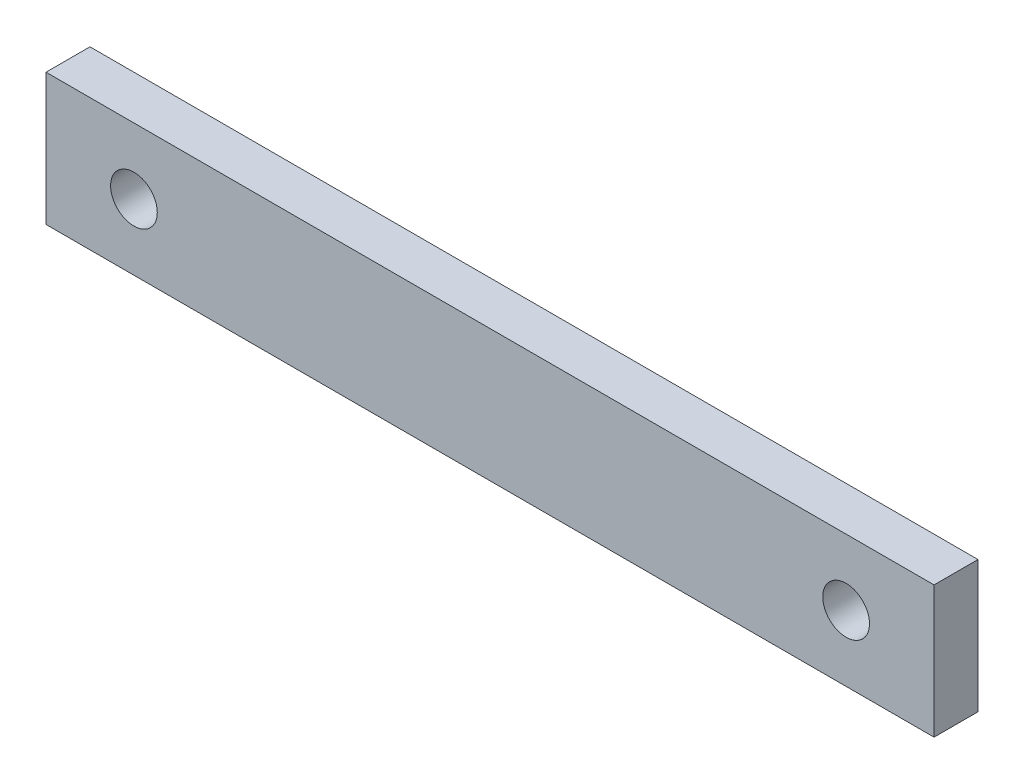
ISO-10303-21;
HEADER;
FILE_DESCRIPTION(('STEP AP214'),'2;1');
FILE_NAME('part.step','',(''),(''),'','','');
FILE_SCHEMA(('AUTOMOTIVE_DESIGN { 1 0 10303 214 1 1 1 1 }'));
ENDSEC;
DATA;
#1=APPLICATION_CONTEXT('core data for automotive mechanical design processes');
#2=APPLICATION_PROTOCOL_DEFINITION('international standard','automotive_design',2000,#1);
#3=PRODUCT_CONTEXT('',#1,'mechanical');
#4=PRODUCT('Part','Part','',(#3));
#5=PRODUCT_RELATED_PRODUCT_CATEGORY('part','',(#4));
#6=PRODUCT_DEFINITION_FORMATION('','',#4);
#7=PRODUCT_DEFINITION_CONTEXT('part definition',#1,'design');
#8=PRODUCT_DEFINITION('design','',#6,#7);
#9=PRODUCT_DEFINITION_SHAPE('','',#8);
#10=(LENGTH_UNIT() NAMED_UNIT(*) SI_UNIT(.MILLI.,.METRE.));
#11=(NAMED_UNIT(*) PLANE_ANGLE_UNIT() SI_UNIT($,.RADIAN.));
#12=(NAMED_UNIT(*) SI_UNIT($,.STERADIAN.) SOLID_ANGLE_UNIT());
#13=UNCERTAINTY_MEASURE_WITH_UNIT(LENGTH_MEASURE(1.E-05),#10,'distance_accuracy_value','');
#14=(GEOMETRIC_REPRESENTATION_CONTEXT(3) GLOBAL_UNCERTAINTY_ASSIGNED_CONTEXT((#13)) GLOBAL_UNIT_ASSIGNED_CONTEXT((#10,
#11,#12)) REPRESENTATION_CONTEXT('',''));
#15=CARTESIAN_POINT('',(0.,0.,0.));
#16=DIRECTION('',(0.,0.,1.));
#17=DIRECTION('',(1.,0.,0.));
#18=AXIS2_PLACEMENT_3D('',#15,#16,#17);
#19=CARTESIAN_POINT('',(64.135,-9.525,6.35));
#20=DIRECTION('',(-1.,0.,0.));
#21=DIRECTION('',(0.,0.,1.));
#22=AXIS2_PLACEMENT_3D('',#19,#20,#21);
#23=PLANE('',#22);
#24=DIRECTION('',(0.,1.,0.));
#25=VECTOR('',#24,1.);
#26=CARTESIAN_POINT('',(64.135,-9.525,0.));
#27=LINE('',#26,#25);
#28=CARTESIAN_POINT('',(64.135,-9.525,0.));
#29=VERTEX_POINT('',#28);
#30=CARTESIAN_POINT('',(64.135,9.525,0.));
#31=VERTEX_POINT('',#30);
#32=EDGE_CURVE('E96',#29,#31,#27,.T.);
#33=ORIENTED_EDGE('',*,*,#32,.T.);
#34=DIRECTION('',(0.,0.,-1.));
#35=VECTOR('',#34,1.);
#36=CARTESIAN_POINT('',(64.135,9.525,6.35));
#37=LINE('',#36,#35);
#38=CARTESIAN_POINT('',(64.135,9.525,6.35));
#39=VERTEX_POINT('',#38);
#40=EDGE_CURVE('E11',#39,#31,#37,.T.);
#41=ORIENTED_EDGE('',*,*,#40,.F.);
#42=DIRECTION('',(0.,1.,0.));
#43=VECTOR('',#42,1.);
#44=CARTESIAN_POINT('',(64.135,-9.525,6.35));
#45=LINE('',#44,#43);
#46=CARTESIAN_POINT('',(64.135,-9.525,6.35));
#47=VERTEX_POINT('',#46);
#48=EDGE_CURVE('E84',#47,#39,#45,.T.);
#49=ORIENTED_EDGE('',*,*,#48,.F.);
#50=DIRECTION('',(0.,0.,-1.));
#51=VECTOR('',#50,1.);
#52=CARTESIAN_POINT('',(64.135,-9.525,6.35));
#53=LINE('',#52,#51);
#54=EDGE_CURVE('E92',#47,#29,#53,.T.);
#55=ORIENTED_EDGE('',*,*,#54,.T.);
#56=EDGE_LOOP('',(#33,#41,#49,#55));
#57=FACE_BOUND('',#56,.T.);
#58=ADVANCED_FACE('F33',(#57),#23,.F.);
#59=CARTESIAN_POINT('',(-64.135,9.525,6.35));
#60=DIRECTION('',(0.,-1.,0.));
#61=DIRECTION('',(0.,0.,-1.));
#62=AXIS2_PLACEMENT_3D('',#59,#60,#61);
#63=PLANE('',#62);
#64=DIRECTION('',(-1.,0.,0.));
#65=VECTOR('',#64,1.);
#66=CARTESIAN_POINT('',(-64.135,9.525,0.));
#67=LINE('',#66,#65);
#68=CARTESIAN_POINT('',(-64.135,9.525,0.));
#69=VERTEX_POINT('',#68);
#70=EDGE_CURVE('E88',#31,#69,#67,.T.);
#71=ORIENTED_EDGE('',*,*,#70,.T.);
#72=DIRECTION('',(0.,0.,-1.));
#73=VECTOR('',#72,1.);
#74=CARTESIAN_POINT('',(-64.135,9.525,6.35));
#75=LINE('',#74,#73);
#76=CARTESIAN_POINT('',(-64.135,9.525,6.35));
#77=VERTEX_POINT('',#76);
#78=EDGE_CURVE('E41',#77,#69,#75,.T.);
#79=ORIENTED_EDGE('',*,*,#78,.F.);
#80=DIRECTION('',(-1.,0.,0.));
#81=VECTOR('',#80,1.);
#82=CARTESIAN_POINT('',(-64.135,9.525,6.35));
#83=LINE('',#82,#81);
#84=EDGE_CURVE('E79',#39,#77,#83,.T.);
#85=ORIENTED_EDGE('',*,*,#84,.F.);
#86=ORIENTED_EDGE('',*,*,#40,.T.);
#87=EDGE_LOOP('',(#71,#79,#85,#86));
#88=FACE_BOUND('',#87,.T.);
#89=ADVANCED_FACE('F87',(#88),#63,.F.);
#90=CARTESIAN_POINT('',(-64.135,-9.525,6.35));
#91=DIRECTION('',(1.,0.,0.));
#92=DIRECTION('',(0.,0.,-1.));
#93=AXIS2_PLACEMENT_3D('',#90,#91,#92);
#94=PLANE('',#93);
#95=DIRECTION('',(0.,-1.,0.));
#96=VECTOR('',#95,1.);
#97=CARTESIAN_POINT('',(-64.135,-9.525,0.));
#98=LINE('',#97,#96);
#99=CARTESIAN_POINT('',(-64.135,-9.525,0.));
#100=VERTEX_POINT('',#99);
#101=EDGE_CURVE('E66',#69,#100,#98,.T.);
#102=ORIENTED_EDGE('',*,*,#101,.T.);
#103=DIRECTION('',(0.,0.,-1.));
#104=VECTOR('',#103,1.);
#105=CARTESIAN_POINT('',(-64.135,-9.525,6.35));
#106=LINE('',#105,#104);
#107=CARTESIAN_POINT('',(-64.135,-9.525,6.35));
#108=VERTEX_POINT('',#107);
#109=EDGE_CURVE('E89',#108,#100,#106,.T.);
#110=ORIENTED_EDGE('',*,*,#109,.F.);
#111=DIRECTION('',(0.,-1.,0.));
#112=VECTOR('',#111,1.);
#113=CARTESIAN_POINT('',(-64.135,-9.525,6.35));
#114=LINE('',#113,#112);
#115=EDGE_CURVE('E82',#77,#108,#114,.T.);
#116=ORIENTED_EDGE('',*,*,#115,.F.);
#117=ORIENTED_EDGE('',*,*,#78,.T.);
#118=EDGE_LOOP('',(#102,#110,#116,#117));
#119=FACE_BOUND('',#118,.T.);
#120=ADVANCED_FACE('F90',(#119),#94,.F.);
#121=CARTESIAN_POINT('',(-64.135,-9.525,6.35));
#122=DIRECTION('',(0.,1.,0.));
#123=DIRECTION('',(0.,0.,1.));
#124=AXIS2_PLACEMENT_3D('',#121,#122,#123);
#125=PLANE('',#124);
#126=DIRECTION('',(1.,0.,0.));
#127=VECTOR('',#126,1.);
#128=CARTESIAN_POINT('',(-64.135,-9.525,0.));
#129=LINE('',#128,#127);
#130=EDGE_CURVE('E72',#100,#29,#129,.T.);
#131=ORIENTED_EDGE('',*,*,#130,.T.);
#132=ORIENTED_EDGE('',*,*,#54,.F.);
#133=DIRECTION('',(1.,0.,0.));
#134=VECTOR('',#133,1.);
#135=CARTESIAN_POINT('',(-64.135,-9.525,6.35));
#136=LINE('',#135,#134);
#137=EDGE_CURVE('E49',#108,#47,#136,.T.);
#138=ORIENTED_EDGE('',*,*,#137,.F.);
#139=ORIENTED_EDGE('',*,*,#109,.T.);
#140=EDGE_LOOP('',(#131,#132,#138,#139));
#141=FACE_BOUND('',#140,.T.);
#142=ADVANCED_FACE('F104',(#141),#125,.F.);
#143=CARTESIAN_POINT('',(0.,0.,6.35));
#144=DIRECTION('',(0.,0.,-1.));
#145=DIRECTION('',(-1.,0.,0.));
#146=AXIS2_PLACEMENT_3D('',#143,#144,#145);
#147=PLANE('',#146);
#148=CARTESIAN_POINT('',(51.435,0.,6.35));
#149=DIRECTION('',(0.,0.,1.));
#150=DIRECTION('',(1.,0.,0.));
#151=AXIS2_PLACEMENT_3D('',#148,#149,#150);
#152=CIRCLE('',#151,3.3734375);
#153=CARTESIAN_POINT('',(54.8084375,0.,6.35));
#154=VERTEX_POINT('',#153);
#155=EDGE_CURVE('E116',#154,#154,#152,.T.);
#156=ORIENTED_EDGE('',*,*,#155,.F.);
#157=EDGE_LOOP('',(#156));
#158=FACE_BOUND('',#157,.T.);
#159=CARTESIAN_POINT('',(-51.435,0.,6.35));
#160=DIRECTION('',(0.,0.,1.));
#161=DIRECTION('',(1.,0.,0.));
#162=AXIS2_PLACEMENT_3D('',#159,#160,#161);
#163=CIRCLE('',#162,3.3734375);
#164=CARTESIAN_POINT('',(-48.0615625,0.,6.35));
#165=VERTEX_POINT('',#164);
#166=EDGE_CURVE('E110',#165,#165,#163,.T.);
#167=ORIENTED_EDGE('',*,*,#166,.F.);
#168=EDGE_LOOP('',(#167));
#169=FACE_BOUND('',#168,.T.);
#170=ORIENTED_EDGE('',*,*,#48,.T.);
#171=ORIENTED_EDGE('',*,*,#84,.T.);
#172=ORIENTED_EDGE('',*,*,#115,.T.);
#173=ORIENTED_EDGE('',*,*,#137,.T.);
#174=EDGE_LOOP('',(#170,#171,#172,#173));
#175=FACE_BOUND('',#174,.T.);
#176=ADVANCED_FACE('F80',(#158,#169,#175),#147,.F.);
#177=CARTESIAN_POINT('',(0.,0.,0.));
#178=DIRECTION('',(0.,0.,-1.));
#179=DIRECTION('',(-1.,0.,0.));
#180=AXIS2_PLACEMENT_3D('',#177,#178,#179);
#181=PLANE('',#180);
#182=CARTESIAN_POINT('',(51.435,0.,0.));
#183=DIRECTION('',(0.,0.,1.));
#184=DIRECTION('',(1.,0.,0.));
#185=AXIS2_PLACEMENT_3D('',#182,#183,#184);
#186=CIRCLE('',#185,3.3734375);
#187=CARTESIAN_POINT('',(54.8084375,0.,0.));
#188=VERTEX_POINT('',#187);
#189=EDGE_CURVE('E113',#188,#188,#186,.T.);
#190=ORIENTED_EDGE('',*,*,#189,.T.);
#191=EDGE_LOOP('',(#190));
#192=FACE_BOUND('',#191,.T.);
#193=CARTESIAN_POINT('',(-51.435,0.,0.));
#194=DIRECTION('',(0.,0.,1.));
#195=DIRECTION('',(1.,0.,0.));
#196=AXIS2_PLACEMENT_3D('',#193,#194,#195);
#197=CIRCLE('',#196,3.3734375);
#198=CARTESIAN_POINT('',(-48.0615625,0.,0.));
#199=VERTEX_POINT('',#198);
#200=EDGE_CURVE('E99',#199,#199,#197,.T.);
#201=ORIENTED_EDGE('',*,*,#200,.T.);
#202=EDGE_LOOP('',(#201));
#203=FACE_BOUND('',#202,.T.);
#204=ORIENTED_EDGE('',*,*,#32,.F.);
#205=ORIENTED_EDGE('',*,*,#130,.F.);
#206=ORIENTED_EDGE('',*,*,#101,.F.);
#207=ORIENTED_EDGE('',*,*,#70,.F.);
#208=EDGE_LOOP('',(#204,#205,#206,#207));
#209=FACE_BOUND('',#208,.T.);
#210=ADVANCED_FACE('F107',(#192,#203,#209),#181,.T.);
#211=CARTESIAN_POINT('',(-51.435,0.,0.));
#212=DIRECTION('',(0.,0.,1.));
#213=DIRECTION('',(1.,0.,0.));
#214=AXIS2_PLACEMENT_3D('',#211,#212,#213);
#215=CYLINDRICAL_SURFACE('',#214,3.3734375);
#216=ORIENTED_EDGE('',*,*,#200,.F.);
#217=EDGE_LOOP('',(#216));
#218=FACE_BOUND('',#217,.T.);
#219=ORIENTED_EDGE('',*,*,#166,.T.);
#220=EDGE_LOOP('',(#219));
#221=FACE_BOUND('',#220,.T.);
#222=ADVANCED_FACE('F127',(#218,#221),#215,.F.);
#223=CARTESIAN_POINT('',(51.435,0.,0.));
#224=DIRECTION('',(0.,0.,1.));
#225=DIRECTION('',(1.,0.,0.));
#226=AXIS2_PLACEMENT_3D('',#223,#224,#225);
#227=CYLINDRICAL_SURFACE('',#226,3.3734375);
#228=ORIENTED_EDGE('',*,*,#189,.F.);
#229=EDGE_LOOP('',(#228));
#230=FACE_BOUND('',#229,.T.);
#231=ORIENTED_EDGE('',*,*,#155,.T.);
#232=EDGE_LOOP('',(#231));
#233=FACE_BOUND('',#232,.T.);
#234=ADVANCED_FACE('F124',(#230,#233),#227,.F.);
#235=CLOSED_SHELL('',(#58,#89,#120,#142,#176,#210,#222,#234));
#236=MANIFOLD_SOLID_BREP('B2',#235);
#237=ADVANCED_BREP_SHAPE_REPRESENTATION('',(#18,#236),#14);
#238=SHAPE_DEFINITION_REPRESENTATION(#9,#237);
ENDSEC;
END-ISO-10303-21;
